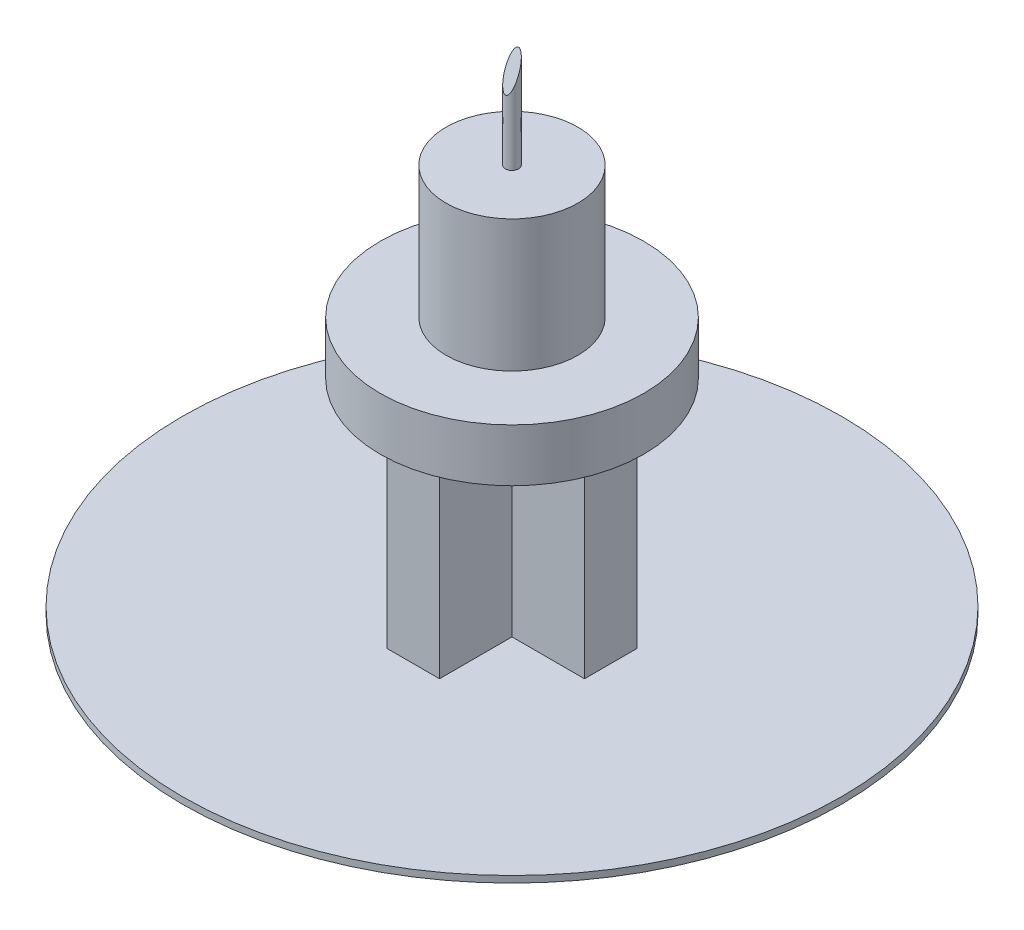
ISO-10303-21;
HEADER;
FILE_DESCRIPTION(('STEP AP214'),'2;1');
FILE_NAME('part.step','',(''),(''),'','','');
FILE_SCHEMA(('AUTOMOTIVE_DESIGN { 1 0 10303 214 1 1 1 1 }'));
ENDSEC;
DATA;
#1=APPLICATION_CONTEXT('core data for automotive mechanical design processes');
#2=APPLICATION_PROTOCOL_DEFINITION('international standard','automotive_design',2000,#1);
#3=PRODUCT_CONTEXT('',#1,'mechanical');
#4=PRODUCT('Part','Part','',(#3));
#5=PRODUCT_RELATED_PRODUCT_CATEGORY('part','',(#4));
#6=PRODUCT_DEFINITION_FORMATION('','',#4);
#7=PRODUCT_DEFINITION_CONTEXT('part definition',#1,'design');
#8=PRODUCT_DEFINITION('design','',#6,#7);
#9=PRODUCT_DEFINITION_SHAPE('','',#8);
#10=(LENGTH_UNIT() NAMED_UNIT(*) SI_UNIT(.MILLI.,.METRE.));
#11=(NAMED_UNIT(*) PLANE_ANGLE_UNIT() SI_UNIT($,.RADIAN.));
#12=(NAMED_UNIT(*) SI_UNIT($,.STERADIAN.) SOLID_ANGLE_UNIT());
#13=UNCERTAINTY_MEASURE_WITH_UNIT(LENGTH_MEASURE(1.E-05),#10,'distance_accuracy_value','');
#14=(GEOMETRIC_REPRESENTATION_CONTEXT(3) GLOBAL_UNCERTAINTY_ASSIGNED_CONTEXT((#13)) GLOBAL_UNIT_ASSIGNED_CONTEXT((#10,
#11,#12)) REPRESENTATION_CONTEXT('',''));
#15=CARTESIAN_POINT('',(0.,0.,0.));
#16=DIRECTION('',(0.,0.,1.));
#17=DIRECTION('',(1.,0.,0.));
#18=AXIS2_PLACEMENT_3D('',#15,#16,#17);
#19=CARTESIAN_POINT('',(0.,0.2,0.));
#20=DIRECTION('',(0.,-1.,0.));
#21=DIRECTION('',(0.,0.,-1.));
#22=AXIS2_PLACEMENT_3D('',#19,#20,#21);
#23=CYLINDRICAL_SURFACE('',#22,10.);
#24=CARTESIAN_POINT('',(0.,0.2,0.));
#25=DIRECTION('',(0.,1.,0.));
#26=DIRECTION('',(0.,0.,1.));
#27=AXIS2_PLACEMENT_3D('',#24,#25,#26);
#28=CIRCLE('',#27,10.);
#29=CARTESIAN_POINT('',(0.,0.2,10.));
#30=VERTEX_POINT('',#29);
#31=EDGE_CURVE('E244',#30,#30,#28,.T.);
#32=ORIENTED_EDGE('',*,*,#31,.F.);
#33=EDGE_LOOP('',(#32));
#34=FACE_BOUND('',#33,.T.);
#35=CARTESIAN_POINT('',(0.,0.,0.));
#36=DIRECTION('',(0.,1.,0.));
#37=DIRECTION('',(0.,0.,1.));
#38=AXIS2_PLACEMENT_3D('',#35,#36,#37);
#39=CIRCLE('',#38,10.);
#40=CARTESIAN_POINT('',(0.,0.,10.));
#41=VERTEX_POINT('',#40);
#42=EDGE_CURVE('E42',#41,#41,#39,.T.);
#43=ORIENTED_EDGE('',*,*,#42,.T.);
#44=EDGE_LOOP('',(#43));
#45=FACE_BOUND('',#44,.T.);
#46=ADVANCED_FACE('F39',(#34,#45),#23,.T.);
#47=CARTESIAN_POINT('',(0.,0.2,0.));
#48=DIRECTION('',(0.,1.,0.));
#49=DIRECTION('',(0.,0.,1.));
#50=AXIS2_PLACEMENT_3D('',#47,#48,#49);
#51=PLANE('',#50);
#52=DIRECTION('',(0.,0.,1.));
#53=VECTOR('',#52,1.);
#54=CARTESIAN_POINT('',(-0.8,0.2,-3.));
#55=LINE('',#54,#53);
#56=CARTESIAN_POINT('',(-0.8,0.2,-3.));
#57=VERTEX_POINT('',#56);
#58=CARTESIAN_POINT('',(-0.799999999999999,0.2,-0.8));
#59=VERTEX_POINT('',#58);
#60=EDGE_CURVE('E56',#57,#59,#55,.T.);
#61=ORIENTED_EDGE('',*,*,#60,.F.);
#62=DIRECTION('',(-1.,0.,0.));
#63=VECTOR('',#62,1.);
#64=CARTESIAN_POINT('',(-0.8,0.2,-3.));
#65=LINE('',#64,#63);
#66=CARTESIAN_POINT('',(0.8,0.2,-3.));
#67=VERTEX_POINT('',#66);
#68=EDGE_CURVE('E60',#67,#57,#65,.T.);
#69=ORIENTED_EDGE('',*,*,#68,.F.);
#70=DIRECTION('',(0.,0.,-1.));
#71=VECTOR('',#70,1.);
#72=CARTESIAN_POINT('',(0.8,0.2,-3.));
#73=LINE('',#72,#71);
#74=CARTESIAN_POINT('',(0.800000000000001,0.2,-0.8));
#75=VERTEX_POINT('',#74);
#76=EDGE_CURVE('E200',#75,#67,#73,.T.);
#77=ORIENTED_EDGE('',*,*,#76,.F.);
#78=DIRECTION('',(-1.,0.,0.));
#79=VECTOR('',#78,1.);
#80=CARTESIAN_POINT('',(0.800000000000001,0.2,-0.8));
#81=LINE('',#80,#79);
#82=CARTESIAN_POINT('',(3.,0.2,-0.8));
#83=VERTEX_POINT('',#82);
#84=EDGE_CURVE('E196',#83,#75,#81,.T.);
#85=ORIENTED_EDGE('',*,*,#84,.F.);
#86=DIRECTION('',(0.,0.,-1.));
#87=VECTOR('',#86,1.);
#88=CARTESIAN_POINT('',(3.,0.2,-0.8));
#89=LINE('',#88,#87);
#90=CARTESIAN_POINT('',(3.,0.2,0.8));
#91=VERTEX_POINT('',#90);
#92=EDGE_CURVE('E192',#91,#83,#89,.T.);
#93=ORIENTED_EDGE('',*,*,#92,.F.);
#94=DIRECTION('',(1.,0.,0.));
#95=VECTOR('',#94,1.);
#96=CARTESIAN_POINT('',(0.800000000000001,0.2,0.8));
#97=LINE('',#96,#95);
#98=CARTESIAN_POINT('',(0.800000000000001,0.2,0.8));
#99=VERTEX_POINT('',#98);
#100=EDGE_CURVE('E188',#99,#91,#97,.T.);
#101=ORIENTED_EDGE('',*,*,#100,.F.);
#102=DIRECTION('',(0.,0.,-1.));
#103=VECTOR('',#102,1.);
#104=CARTESIAN_POINT('',(0.800000000000001,0.2,0.8));
#105=LINE('',#104,#103);
#106=CARTESIAN_POINT('',(0.800000000000001,0.2,3.));
#107=VERTEX_POINT('',#106);
#108=EDGE_CURVE('E184',#107,#99,#105,.T.);
#109=ORIENTED_EDGE('',*,*,#108,.F.);
#110=DIRECTION('',(1.,0.,0.));
#111=VECTOR('',#110,1.);
#112=CARTESIAN_POINT('',(-0.799999999999999,0.2,3.));
#113=LINE('',#112,#111);
#114=CARTESIAN_POINT('',(-0.799999999999999,0.2,3.));
#115=VERTEX_POINT('',#114);
#116=EDGE_CURVE('E180',#115,#107,#113,.T.);
#117=ORIENTED_EDGE('',*,*,#116,.F.);
#118=DIRECTION('',(0.,0.,1.));
#119=VECTOR('',#118,1.);
#120=CARTESIAN_POINT('',(-0.799999999999999,0.2,0.8));
#121=LINE('',#120,#119);
#122=CARTESIAN_POINT('',(-0.799999999999999,0.2,0.8));
#123=VERTEX_POINT('',#122);
#124=EDGE_CURVE('E176',#123,#115,#121,.T.);
#125=ORIENTED_EDGE('',*,*,#124,.F.);
#126=DIRECTION('',(1.,0.,0.));
#127=VECTOR('',#126,1.);
#128=CARTESIAN_POINT('',(-3.,0.2,0.8));
#129=LINE('',#128,#127);
#130=CARTESIAN_POINT('',(-3.,0.2,0.8));
#131=VERTEX_POINT('',#130);
#132=EDGE_CURVE('E172',#131,#123,#129,.T.);
#133=ORIENTED_EDGE('',*,*,#132,.F.);
#134=DIRECTION('',(0.,0.,1.));
#135=VECTOR('',#134,1.);
#136=CARTESIAN_POINT('',(-3.,0.2,-0.8));
#137=LINE('',#136,#135);
#138=CARTESIAN_POINT('',(-3.,0.2,-0.8));
#139=VERTEX_POINT('',#138);
#140=EDGE_CURVE('E168',#139,#131,#137,.T.);
#141=ORIENTED_EDGE('',*,*,#140,.F.);
#142=DIRECTION('',(-1.,0.,0.));
#143=VECTOR('',#142,1.);
#144=CARTESIAN_POINT('',(-3.,0.2,-0.8));
#145=LINE('',#144,#143);
#146=EDGE_CURVE('E163',#59,#139,#145,.T.);
#147=ORIENTED_EDGE('',*,*,#146,.F.);
#148=EDGE_LOOP('',(#61,#69,#77,#85,#93,#101,#109,#117,#125,#133,#141,#147));
#149=FACE_BOUND('',#148,.T.);
#150=ORIENTED_EDGE('',*,*,#31,.T.);
#151=EDGE_LOOP('',(#150));
#152=FACE_BOUND('',#151,.T.);
#153=ADVANCED_FACE('F259',(#149,#152),#51,.T.);
#154=CARTESIAN_POINT('',(0.,0.,0.));
#155=DIRECTION('',(0.,1.,0.));
#156=DIRECTION('',(0.,0.,1.));
#157=AXIS2_PLACEMENT_3D('',#154,#155,#156);
#158=PLANE('',#157);
#159=CARTESIAN_POINT('',(0.,0.,0.));
#160=DIRECTION('',(0.,-1.,0.));
#161=DIRECTION('',(0.,0.,-1.));
#162=AXIS2_PLACEMENT_3D('',#159,#160,#161);
#163=CIRCLE('',#162,7.);
#164=CARTESIAN_POINT('',(0.,0.,-7.));
#165=VERTEX_POINT('',#164);
#166=EDGE_CURVE('E48',#165,#165,#163,.T.);
#167=ORIENTED_EDGE('',*,*,#166,.F.);
#168=EDGE_LOOP('',(#167));
#169=FACE_BOUND('',#168,.T.);
#170=ORIENTED_EDGE('',*,*,#42,.F.);
#171=EDGE_LOOP('',(#170));
#172=FACE_BOUND('',#171,.T.);
#173=ADVANCED_FACE('F257',(#169,#172),#158,.F.);
#174=CARTESIAN_POINT('',(-0.8,6.2,-3.));
#175=DIRECTION('',(1.,0.,0.));
#176=DIRECTION('',(0.,0.,-1.));
#177=AXIS2_PLACEMENT_3D('',#174,#175,#176);
#178=PLANE('',#177);
#179=ORIENTED_EDGE('',*,*,#60,.T.);
#180=DIRECTION('',(0.,-1.,0.));
#181=VECTOR('',#180,1.);
#182=CARTESIAN_POINT('',(-0.799999999999999,6.2,-0.8));
#183=LINE('',#182,#181);
#184=CARTESIAN_POINT('',(-0.799999999999999,6.2,-0.8));
#185=VERTEX_POINT('',#184);
#186=EDGE_CURVE('E134',#185,#59,#183,.T.);
#187=ORIENTED_EDGE('',*,*,#186,.F.);
#188=DIRECTION('',(0.,0.,1.));
#189=VECTOR('',#188,1.);
#190=CARTESIAN_POINT('',(-0.8,6.2,-3.));
#191=LINE('',#190,#189);
#192=CARTESIAN_POINT('',(-0.8,6.2,-3.));
#193=VERTEX_POINT('',#192);
#194=EDGE_CURVE('E129',#193,#185,#191,.T.);
#195=ORIENTED_EDGE('',*,*,#194,.F.);
#196=DIRECTION('',(0.,-1.,0.));
#197=VECTOR('',#196,1.);
#198=CARTESIAN_POINT('',(-0.8,6.2,-3.));
#199=LINE('',#198,#197);
#200=EDGE_CURVE('E132',#193,#57,#199,.T.);
#201=ORIENTED_EDGE('',*,*,#200,.T.);
#202=EDGE_LOOP('',(#179,#187,#195,#201));
#203=FACE_BOUND('',#202,.T.);
#204=ADVANCED_FACE('F131',(#203),#178,.F.);
#205=CARTESIAN_POINT('',(-3.,6.2,-0.8));
#206=DIRECTION('',(0.,0.,1.));
#207=DIRECTION('',(1.,0.,0.));
#208=AXIS2_PLACEMENT_3D('',#205,#206,#207);
#209=PLANE('',#208);
#210=ORIENTED_EDGE('',*,*,#146,.T.);
#211=DIRECTION('',(0.,-1.,0.));
#212=VECTOR('',#211,1.);
#213=CARTESIAN_POINT('',(-3.,6.2,-0.8));
#214=LINE('',#213,#212);
#215=CARTESIAN_POINT('',(-3.,6.2,-0.8));
#216=VERTEX_POINT('',#215);
#217=EDGE_CURVE('E239',#216,#139,#214,.T.);
#218=ORIENTED_EDGE('',*,*,#217,.F.);
#219=DIRECTION('',(-1.,0.,0.));
#220=VECTOR('',#219,1.);
#221=CARTESIAN_POINT('',(-3.,6.2,-0.8));
#222=LINE('',#221,#220);
#223=EDGE_CURVE('E139',#185,#216,#222,.T.);
#224=ORIENTED_EDGE('',*,*,#223,.F.);
#225=ORIENTED_EDGE('',*,*,#186,.T.);
#226=EDGE_LOOP('',(#210,#218,#224,#225));
#227=FACE_BOUND('',#226,.T.);
#228=ADVANCED_FACE('F265',(#227),#209,.F.);
#229=CARTESIAN_POINT('',(-3.,6.2,-0.8));
#230=DIRECTION('',(1.,0.,0.));
#231=DIRECTION('',(0.,0.,-1.));
#232=AXIS2_PLACEMENT_3D('',#229,#230,#231);
#233=PLANE('',#232);
#234=ORIENTED_EDGE('',*,*,#140,.T.);
#235=DIRECTION('',(0.,-1.,0.));
#236=VECTOR('',#235,1.);
#237=CARTESIAN_POINT('',(-3.,6.2,0.8));
#238=LINE('',#237,#236);
#239=CARTESIAN_POINT('',(-3.,6.2,0.8));
#240=VERTEX_POINT('',#239);
#241=EDGE_CURVE('E235',#240,#131,#238,.T.);
#242=ORIENTED_EDGE('',*,*,#241,.F.);
#243=DIRECTION('',(0.,0.,1.));
#244=VECTOR('',#243,1.);
#245=CARTESIAN_POINT('',(-3.,6.2,-0.8));
#246=LINE('',#245,#244);
#247=EDGE_CURVE('E514',#216,#240,#246,.T.);
#248=ORIENTED_EDGE('',*,*,#247,.F.);
#249=ORIENTED_EDGE('',*,*,#217,.T.);
#250=EDGE_LOOP('',(#234,#242,#248,#249));
#251=FACE_BOUND('',#250,.T.);
#252=ADVANCED_FACE('F293',(#251),#233,.F.);
#253=CARTESIAN_POINT('',(-3.,6.2,0.8));
#254=DIRECTION('',(0.,0.,-1.));
#255=DIRECTION('',(-1.,0.,0.));
#256=AXIS2_PLACEMENT_3D('',#253,#254,#255);
#257=PLANE('',#256);
#258=ORIENTED_EDGE('',*,*,#132,.T.);
#259=DIRECTION('',(0.,-1.,0.));
#260=VECTOR('',#259,1.);
#261=CARTESIAN_POINT('',(-0.799999999999999,6.2,0.8));
#262=LINE('',#261,#260);
#263=CARTESIAN_POINT('',(-0.799999999999999,6.2,0.8));
#264=VERTEX_POINT('',#263);
#265=EDGE_CURVE('E231',#264,#123,#262,.T.);
#266=ORIENTED_EDGE('',*,*,#265,.F.);
#267=DIRECTION('',(1.,0.,0.));
#268=VECTOR('',#267,1.);
#269=CARTESIAN_POINT('',(-3.,6.2,0.8));
#270=LINE('',#269,#268);
#271=EDGE_CURVE('E518',#240,#264,#270,.T.);
#272=ORIENTED_EDGE('',*,*,#271,.F.);
#273=ORIENTED_EDGE('',*,*,#241,.T.);
#274=EDGE_LOOP('',(#258,#266,#272,#273));
#275=FACE_BOUND('',#274,.T.);
#276=ADVANCED_FACE('F303',(#275),#257,.F.);
#277=CARTESIAN_POINT('',(-0.799999999999999,6.2,0.8));
#278=DIRECTION('',(1.,0.,0.));
#279=DIRECTION('',(0.,0.,-1.));
#280=AXIS2_PLACEMENT_3D('',#277,#278,#279);
#281=PLANE('',#280);
#282=ORIENTED_EDGE('',*,*,#124,.T.);
#283=DIRECTION('',(0.,-1.,0.));
#284=VECTOR('',#283,1.);
#285=CARTESIAN_POINT('',(-0.799999999999999,6.2,3.));
#286=LINE('',#285,#284);
#287=CARTESIAN_POINT('',(-0.799999999999999,6.2,3.));
#288=VERTEX_POINT('',#287);
#289=EDGE_CURVE('E227',#288,#115,#286,.T.);
#290=ORIENTED_EDGE('',*,*,#289,.F.);
#291=DIRECTION('',(0.,0.,1.));
#292=VECTOR('',#291,1.);
#293=CARTESIAN_POINT('',(-0.799999999999999,6.2,0.8));
#294=LINE('',#293,#292);
#295=EDGE_CURVE('E522',#264,#288,#294,.T.);
#296=ORIENTED_EDGE('',*,*,#295,.F.);
#297=ORIENTED_EDGE('',*,*,#265,.T.);
#298=EDGE_LOOP('',(#282,#290,#296,#297));
#299=FACE_BOUND('',#298,.T.);
#300=ADVANCED_FACE('F313',(#299),#281,.F.);
#301=CARTESIAN_POINT('',(-0.799999999999999,6.2,3.));
#302=DIRECTION('',(0.,0.,-1.));
#303=DIRECTION('',(-1.,0.,0.));
#304=AXIS2_PLACEMENT_3D('',#301,#302,#303);
#305=PLANE('',#304);
#306=ORIENTED_EDGE('',*,*,#116,.T.);
#307=DIRECTION('',(0.,-1.,0.));
#308=VECTOR('',#307,1.);
#309=CARTESIAN_POINT('',(0.800000000000001,6.2,3.));
#310=LINE('',#309,#308);
#311=CARTESIAN_POINT('',(0.800000000000001,6.2,3.));
#312=VERTEX_POINT('',#311);
#313=EDGE_CURVE('E223',#312,#107,#310,.T.);
#314=ORIENTED_EDGE('',*,*,#313,.F.);
#315=DIRECTION('',(1.,0.,0.));
#316=VECTOR('',#315,1.);
#317=CARTESIAN_POINT('',(-0.799999999999999,6.2,3.));
#318=LINE('',#317,#316);
#319=EDGE_CURVE('E526',#288,#312,#318,.T.);
#320=ORIENTED_EDGE('',*,*,#319,.F.);
#321=ORIENTED_EDGE('',*,*,#289,.T.);
#322=EDGE_LOOP('',(#306,#314,#320,#321));
#323=FACE_BOUND('',#322,.T.);
#324=ADVANCED_FACE('F323',(#323),#305,.F.);
#325=CARTESIAN_POINT('',(0.800000000000001,6.2,0.8));
#326=DIRECTION('',(-1.,0.,0.));
#327=DIRECTION('',(0.,0.,1.));
#328=AXIS2_PLACEMENT_3D('',#325,#326,#327);
#329=PLANE('',#328);
#330=ORIENTED_EDGE('',*,*,#108,.T.);
#331=DIRECTION('',(0.,-1.,0.));
#332=VECTOR('',#331,1.);
#333=CARTESIAN_POINT('',(0.800000000000001,6.2,0.8));
#334=LINE('',#333,#332);
#335=CARTESIAN_POINT('',(0.800000000000001,6.2,0.8));
#336=VERTEX_POINT('',#335);
#337=EDGE_CURVE('E219',#336,#99,#334,.T.);
#338=ORIENTED_EDGE('',*,*,#337,.F.);
#339=DIRECTION('',(0.,0.,-1.));
#340=VECTOR('',#339,1.);
#341=CARTESIAN_POINT('',(0.800000000000001,6.2,0.8));
#342=LINE('',#341,#340);
#343=EDGE_CURVE('E530',#312,#336,#342,.T.);
#344=ORIENTED_EDGE('',*,*,#343,.F.);
#345=ORIENTED_EDGE('',*,*,#313,.T.);
#346=EDGE_LOOP('',(#330,#338,#344,#345));
#347=FACE_BOUND('',#346,.T.);
#348=ADVANCED_FACE('F333',(#347),#329,.F.);
#349=CARTESIAN_POINT('',(0.800000000000001,6.2,0.8));
#350=DIRECTION('',(0.,0.,-1.));
#351=DIRECTION('',(-1.,0.,0.));
#352=AXIS2_PLACEMENT_3D('',#349,#350,#351);
#353=PLANE('',#352);
#354=ORIENTED_EDGE('',*,*,#100,.T.);
#355=DIRECTION('',(0.,-1.,0.));
#356=VECTOR('',#355,1.);
#357=CARTESIAN_POINT('',(3.,6.2,0.8));
#358=LINE('',#357,#356);
#359=CARTESIAN_POINT('',(3.,6.2,0.8));
#360=VERTEX_POINT('',#359);
#361=EDGE_CURVE('E215',#360,#91,#358,.T.);
#362=ORIENTED_EDGE('',*,*,#361,.F.);
#363=DIRECTION('',(1.,0.,0.));
#364=VECTOR('',#363,1.);
#365=CARTESIAN_POINT('',(0.800000000000001,6.2,0.8));
#366=LINE('',#365,#364);
#367=EDGE_CURVE('E534',#336,#360,#366,.T.);
#368=ORIENTED_EDGE('',*,*,#367,.F.);
#369=ORIENTED_EDGE('',*,*,#337,.T.);
#370=EDGE_LOOP('',(#354,#362,#368,#369));
#371=FACE_BOUND('',#370,.T.);
#372=ADVANCED_FACE('F343',(#371),#353,.F.);
#373=CARTESIAN_POINT('',(3.,6.2,-0.8));
#374=DIRECTION('',(-1.,0.,0.));
#375=DIRECTION('',(0.,0.,1.));
#376=AXIS2_PLACEMENT_3D('',#373,#374,#375);
#377=PLANE('',#376);
#378=ORIENTED_EDGE('',*,*,#92,.T.);
#379=DIRECTION('',(0.,-1.,0.));
#380=VECTOR('',#379,1.);
#381=CARTESIAN_POINT('',(3.,6.2,-0.8));
#382=LINE('',#381,#380);
#383=CARTESIAN_POINT('',(3.,6.2,-0.8));
#384=VERTEX_POINT('',#383);
#385=EDGE_CURVE('E211',#384,#83,#382,.T.);
#386=ORIENTED_EDGE('',*,*,#385,.F.);
#387=DIRECTION('',(0.,0.,-1.));
#388=VECTOR('',#387,1.);
#389=CARTESIAN_POINT('',(3.,6.2,-0.8));
#390=LINE('',#389,#388);
#391=EDGE_CURVE('E538',#360,#384,#390,.T.);
#392=ORIENTED_EDGE('',*,*,#391,.F.);
#393=ORIENTED_EDGE('',*,*,#361,.T.);
#394=EDGE_LOOP('',(#378,#386,#392,#393));
#395=FACE_BOUND('',#394,.T.);
#396=ADVANCED_FACE('F353',(#395),#377,.F.);
#397=CARTESIAN_POINT('',(0.800000000000001,6.2,-0.8));
#398=DIRECTION('',(0.,0.,1.));
#399=DIRECTION('',(1.,0.,0.));
#400=AXIS2_PLACEMENT_3D('',#397,#398,#399);
#401=PLANE('',#400);
#402=ORIENTED_EDGE('',*,*,#84,.T.);
#403=DIRECTION('',(0.,-1.,0.));
#404=VECTOR('',#403,1.);
#405=CARTESIAN_POINT('',(0.800000000000001,6.2,-0.8));
#406=LINE('',#405,#404);
#407=CARTESIAN_POINT('',(0.800000000000001,6.2,-0.8));
#408=VERTEX_POINT('',#407);
#409=EDGE_CURVE('E207',#408,#75,#406,.T.);
#410=ORIENTED_EDGE('',*,*,#409,.F.);
#411=DIRECTION('',(-1.,0.,0.));
#412=VECTOR('',#411,1.);
#413=CARTESIAN_POINT('',(0.800000000000001,6.2,-0.8));
#414=LINE('',#413,#412);
#415=EDGE_CURVE('E157',#384,#408,#414,.T.);
#416=ORIENTED_EDGE('',*,*,#415,.F.);
#417=ORIENTED_EDGE('',*,*,#385,.T.);
#418=EDGE_LOOP('',(#402,#410,#416,#417));
#419=FACE_BOUND('',#418,.T.);
#420=ADVANCED_FACE('F363',(#419),#401,.F.);
#421=CARTESIAN_POINT('',(0.8,6.2,-3.));
#422=DIRECTION('',(-1.,0.,0.));
#423=DIRECTION('',(0.,0.,1.));
#424=AXIS2_PLACEMENT_3D('',#421,#422,#423);
#425=PLANE('',#424);
#426=ORIENTED_EDGE('',*,*,#76,.T.);
#427=DIRECTION('',(0.,-1.,0.));
#428=VECTOR('',#427,1.);
#429=CARTESIAN_POINT('',(0.8,6.2,-3.));
#430=LINE('',#429,#428);
#431=CARTESIAN_POINT('',(0.8,6.2,-3.));
#432=VERTEX_POINT('',#431);
#433=EDGE_CURVE('E148',#432,#67,#430,.T.);
#434=ORIENTED_EDGE('',*,*,#433,.F.);
#435=DIRECTION('',(0.,0.,-1.));
#436=VECTOR('',#435,1.);
#437=CARTESIAN_POINT('',(0.8,6.2,-3.));
#438=LINE('',#437,#436);
#439=EDGE_CURVE('E153',#408,#432,#438,.T.);
#440=ORIENTED_EDGE('',*,*,#439,.F.);
#441=ORIENTED_EDGE('',*,*,#409,.T.);
#442=EDGE_LOOP('',(#426,#434,#440,#441));
#443=FACE_BOUND('',#442,.T.);
#444=ADVANCED_FACE('F373',(#443),#425,.F.);
#445=CARTESIAN_POINT('',(-0.8,6.2,-3.));
#446=DIRECTION('',(0.,0.,1.));
#447=DIRECTION('',(1.,0.,0.));
#448=AXIS2_PLACEMENT_3D('',#445,#446,#447);
#449=PLANE('',#448);
#450=ORIENTED_EDGE('',*,*,#68,.T.);
#451=ORIENTED_EDGE('',*,*,#200,.F.);
#452=DIRECTION('',(-1.,0.,0.));
#453=VECTOR('',#452,1.);
#454=CARTESIAN_POINT('',(-0.8,6.2,-3.));
#455=LINE('',#454,#453);
#456=EDGE_CURVE('E145',#432,#193,#455,.T.);
#457=ORIENTED_EDGE('',*,*,#456,.F.);
#458=ORIENTED_EDGE('',*,*,#433,.T.);
#459=EDGE_LOOP('',(#450,#451,#457,#458));
#460=FACE_BOUND('',#459,.T.);
#461=ADVANCED_FACE('F143',(#460),#449,.F.);
#462=CARTESIAN_POINT('',(0.,6.2,0.));
#463=DIRECTION('',(0.,1.,0.));
#464=DIRECTION('',(0.,0.,1.));
#465=AXIS2_PLACEMENT_3D('',#462,#463,#464);
#466=PLANE('',#465);
#467=CARTESIAN_POINT('',(0.,6.2,0.));
#468=DIRECTION('',(0.,1.,0.));
#469=DIRECTION('',(0.,0.,1.));
#470=AXIS2_PLACEMENT_3D('',#467,#468,#469);
#471=CIRCLE('',#470,4.);
#472=CARTESIAN_POINT('',(0.,6.2,4.));
#473=VERTEX_POINT('',#472);
#474=EDGE_CURVE('E504',#473,#473,#471,.T.);
#475=ORIENTED_EDGE('',*,*,#474,.F.);
#476=EDGE_LOOP('',(#475));
#477=FACE_BOUND('',#476,.T.);
#478=ORIENTED_EDGE('',*,*,#456,.T.);
#479=ORIENTED_EDGE('',*,*,#194,.T.);
#480=ORIENTED_EDGE('',*,*,#223,.T.);
#481=ORIENTED_EDGE('',*,*,#247,.T.);
#482=ORIENTED_EDGE('',*,*,#271,.T.);
#483=ORIENTED_EDGE('',*,*,#295,.T.);
#484=ORIENTED_EDGE('',*,*,#319,.T.);
#485=ORIENTED_EDGE('',*,*,#343,.T.);
#486=ORIENTED_EDGE('',*,*,#367,.T.);
#487=ORIENTED_EDGE('',*,*,#391,.T.);
#488=ORIENTED_EDGE('',*,*,#415,.T.);
#489=ORIENTED_EDGE('',*,*,#439,.T.);
#490=EDGE_LOOP('',(#478,#479,#480,#481,#482,#483,#484,#485,#486,#487,#488,#489));
#491=FACE_BOUND('',#490,.T.);
#492=ADVANCED_FACE('F150',(#477,#491),#466,.F.);
#493=CARTESIAN_POINT('',(0.,7.8,0.));
#494=DIRECTION('',(0.,-1.,0.));
#495=DIRECTION('',(0.,0.,-1.));
#496=AXIS2_PLACEMENT_3D('',#493,#494,#495);
#497=CYLINDRICAL_SURFACE('',#496,4.);
#498=CARTESIAN_POINT('',(0.,7.8,0.));
#499=DIRECTION('',(0.,1.,0.));
#500=DIRECTION('',(0.,0.,1.));
#501=AXIS2_PLACEMENT_3D('',#498,#499,#500);
#502=CIRCLE('',#501,4.);
#503=CARTESIAN_POINT('',(0.,7.8,4.));
#504=VERTEX_POINT('',#503);
#505=EDGE_CURVE('E164',#504,#504,#502,.T.);
#506=ORIENTED_EDGE('',*,*,#505,.F.);
#507=EDGE_LOOP('',(#506));
#508=FACE_BOUND('',#507,.T.);
#509=ORIENTED_EDGE('',*,*,#474,.T.);
#510=EDGE_LOOP('',(#509));
#511=FACE_BOUND('',#510,.T.);
#512=ADVANCED_FACE('F400',(#508,#511),#497,.T.);
#513=CARTESIAN_POINT('',(0.,7.8,0.));
#514=DIRECTION('',(0.,1.,0.));
#515=DIRECTION('',(0.,0.,1.));
#516=AXIS2_PLACEMENT_3D('',#513,#514,#515);
#517=PLANE('',#516);
#518=CARTESIAN_POINT('',(0.,7.8,0.));
#519=DIRECTION('',(0.,1.,0.));
#520=DIRECTION('',(0.,0.,1.));
#521=AXIS2_PLACEMENT_3D('',#518,#519,#520);
#522=CIRCLE('',#521,2.);
#523=CARTESIAN_POINT('',(0.,7.8,2.));
#524=VERTEX_POINT('',#523);
#525=EDGE_CURVE('E11',#524,#524,#522,.T.);
#526=ORIENTED_EDGE('',*,*,#525,.F.);
#527=EDGE_LOOP('',(#526));
#528=FACE_BOUND('',#527,.T.);
#529=ORIENTED_EDGE('',*,*,#505,.T.);
#530=EDGE_LOOP('',(#529));
#531=FACE_BOUND('',#530,.T.);
#532=ADVANCED_FACE('F409',(#528,#531),#517,.T.);
#533=CARTESIAN_POINT('',(0.,-0.22,0.));
#534=DIRECTION('',(0.,1.,0.));
#535=DIRECTION('',(0.,0.,1.));
#536=AXIS2_PLACEMENT_3D('',#533,#534,#535);
#537=CYLINDRICAL_SURFACE('',#536,7.);
#538=CARTESIAN_POINT('',(0.,-0.22,0.));
#539=DIRECTION('',(0.,-1.,0.));
#540=DIRECTION('',(0.,0.,-1.));
#541=AXIS2_PLACEMENT_3D('',#538,#539,#540);
#542=CIRCLE('',#541,7.);
#543=CARTESIAN_POINT('',(0.,-0.22,-7.));
#544=VERTEX_POINT('',#543);
#545=EDGE_CURVE('E500',#544,#544,#542,.T.);
#546=ORIENTED_EDGE('',*,*,#545,.F.);
#547=EDGE_LOOP('',(#546));
#548=FACE_BOUND('',#547,.T.);
#549=ORIENTED_EDGE('',*,*,#166,.T.);
#550=EDGE_LOOP('',(#549));
#551=FACE_BOUND('',#550,.T.);
#552=ADVANCED_FACE('F421',(#548,#551),#537,.T.);
#553=CARTESIAN_POINT('',(0.,-0.22,0.));
#554=DIRECTION('',(0.,-1.,0.));
#555=DIRECTION('',(0.,0.,-1.));
#556=AXIS2_PLACEMENT_3D('',#553,#554,#555);
#557=PLANE('',#556);
#558=ORIENTED_EDGE('',*,*,#545,.T.);
#559=EDGE_LOOP('',(#558));
#560=FACE_BOUND('',#559,.T.);
#561=ADVANCED_FACE('F426',(#560),#557,.T.);
#562=CARTESIAN_POINT('',(0.,11.8,0.));
#563=DIRECTION('',(0.,-1.,0.));
#564=DIRECTION('',(0.,0.,-1.));
#565=AXIS2_PLACEMENT_3D('',#562,#563,#564);
#566=CYLINDRICAL_SURFACE('',#565,2.);
#567=CARTESIAN_POINT('',(0.,11.8,0.));
#568=DIRECTION('',(0.,1.,0.));
#569=DIRECTION('',(0.,0.,1.));
#570=AXIS2_PLACEMENT_3D('',#567,#568,#569);
#571=CIRCLE('',#570,2.);
#572=CARTESIAN_POINT('',(0.,11.8,2.));
#573=VERTEX_POINT('',#572);
#574=EDGE_CURVE('E495',#573,#573,#571,.T.);
#575=ORIENTED_EDGE('',*,*,#574,.F.);
#576=EDGE_LOOP('',(#575));
#577=FACE_BOUND('',#576,.T.);
#578=ORIENTED_EDGE('',*,*,#525,.T.);
#579=EDGE_LOOP('',(#578));
#580=FACE_BOUND('',#579,.T.);
#581=ADVANCED_FACE('F436',(#577,#580),#566,.T.);
#582=CARTESIAN_POINT('',(0.,11.8,0.));
#583=DIRECTION('',(0.,1.,0.));
#584=DIRECTION('',(0.,0.,1.));
#585=AXIS2_PLACEMENT_3D('',#582,#583,#584);
#586=PLANE('',#585);
#587=CARTESIAN_POINT('',(0.,11.8,0.));
#588=DIRECTION('',(0.,1.,0.));
#589=DIRECTION('',(0.,0.,1.));
#590=AXIS2_PLACEMENT_3D('',#587,#588,#589);
#591=CIRCLE('',#590,0.2);
#592=CARTESIAN_POINT('',(0.,11.8,0.2));
#593=VERTEX_POINT('',#592);
#594=EDGE_CURVE('E491',#593,#593,#591,.T.);
#595=ORIENTED_EDGE('',*,*,#594,.F.);
#596=EDGE_LOOP('',(#595));
#597=FACE_BOUND('',#596,.T.);
#598=ORIENTED_EDGE('',*,*,#574,.T.);
#599=EDGE_LOOP('',(#598));
#600=FACE_BOUND('',#599,.T.);
#601=ADVANCED_FACE('F453',(#597,#600),#586,.T.);
#602=CARTESIAN_POINT('',(0.,14.8,0.));
#603=DIRECTION('',(0.,-1.,0.));
#604=DIRECTION('',(0.,0.,-1.));
#605=AXIS2_PLACEMENT_3D('',#602,#603,#604);
#606=CYLINDRICAL_SURFACE('',#605,0.2);
#607=CARTESIAN_POINT('',(0.,14.2702946370937,0.));
#608=DIRECTION('',(0.,-0.353229136270877,-0.935536839087232));
#609=DIRECTION('',(0.,-0.935536839087233,0.353229136270877));
#610=AXIS2_PLACEMENT_3D('',#607,#608,#609);
#611=ELLIPSE('',#610,0.566204708115098,0.2);
#612=CARTESIAN_POINT('',(0.,13.7405892741874,0.2));
#613=VERTEX_POINT('',#612);
#614=EDGE_CURVE('E489',#613,#613,#611,.T.);
#615=ORIENTED_EDGE('',*,*,#614,.T.);
#616=EDGE_LOOP('',(#615));
#617=FACE_BOUND('',#616,.T.);
#618=ORIENTED_EDGE('',*,*,#594,.T.);
#619=EDGE_LOOP('',(#618));
#620=FACE_BOUND('',#619,.T.);
#621=ADVANCED_FACE('F463',(#617,#620),#606,.T.);
#622=CARTESIAN_POINT('',(-1.5,13.7405892741874,0.2));
#623=DIRECTION('',(0.,-0.353229136270877,-0.935536839087232));
#624=DIRECTION('',(0.,0.935536839087232,-0.353229136270877));
#625=AXIS2_PLACEMENT_3D('',#622,#623,#624);
#626=PLANE('',#625);
#627=ORIENTED_EDGE('',*,*,#614,.F.);
#628=EDGE_LOOP('',(#627));
#629=FACE_BOUND('',#628,.T.);
#630=ADVANCED_FACE('F473',(#629),#626,.F.);
#631=CLOSED_SHELL('',(#46,#153,#173,#204,#228,#252,#276,#300,#324,#348,#372,#396,#420,#444,#461,
#492,#512,#532,#552,#561,#581,#601,#621,#630));
#632=MANIFOLD_SOLID_BREP('B2',#631);
#633=ADVANCED_BREP_SHAPE_REPRESENTATION('',(#18,#632),#14);
#634=SHAPE_DEFINITION_REPRESENTATION(#9,#633);
ENDSEC;
END-ISO-10303-21;
